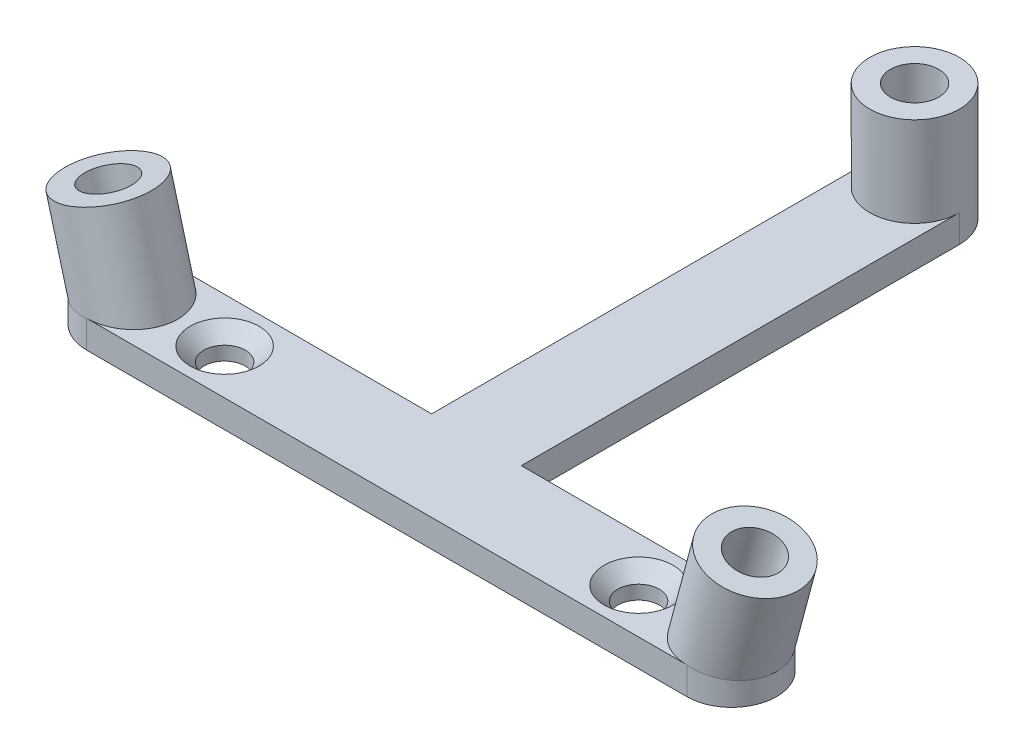
ISO-10303-21;
HEADER;
FILE_DESCRIPTION(('STEP AP214'),'2;1');
FILE_NAME('part.step','',(''),(''),'','','');
FILE_SCHEMA(('AUTOMOTIVE_DESIGN { 1 0 10303 214 1 1 1 1 }'));
ENDSEC;
DATA;
#1=APPLICATION_CONTEXT('core data for automotive mechanical design processes');
#2=APPLICATION_PROTOCOL_DEFINITION('international standard','automotive_design',2000,#1);
#3=PRODUCT_CONTEXT('',#1,'mechanical');
#4=PRODUCT('Part','Part','',(#3));
#5=PRODUCT_RELATED_PRODUCT_CATEGORY('part','',(#4));
#6=PRODUCT_DEFINITION_FORMATION('','',#4);
#7=PRODUCT_DEFINITION_CONTEXT('part definition',#1,'design');
#8=PRODUCT_DEFINITION('design','',#6,#7);
#9=PRODUCT_DEFINITION_SHAPE('','',#8);
#10=(LENGTH_UNIT() NAMED_UNIT(*) SI_UNIT(.MILLI.,.METRE.));
#11=(NAMED_UNIT(*) PLANE_ANGLE_UNIT() SI_UNIT($,.RADIAN.));
#12=(NAMED_UNIT(*) SI_UNIT($,.STERADIAN.) SOLID_ANGLE_UNIT());
#13=UNCERTAINTY_MEASURE_WITH_UNIT(LENGTH_MEASURE(1.E-05),#10,'distance_accuracy_value','');
#14=(GEOMETRIC_REPRESENTATION_CONTEXT(3) GLOBAL_UNCERTAINTY_ASSIGNED_CONTEXT((#13)) GLOBAL_UNIT_ASSIGNED_CONTEXT((#10,
#11,#12)) REPRESENTATION_CONTEXT('',''));
#15=CARTESIAN_POINT('',(0.,0.,0.));
#16=DIRECTION('',(0.,0.,1.));
#17=DIRECTION('',(1.,0.,0.));
#18=AXIS2_PLACEMENT_3D('',#15,#16,#17);
#19=CARTESIAN_POINT('',(21.75,52.4207298638169,0.));
#20=DIRECTION('',(0.,-1.,0.));
#21=DIRECTION('',(0.,0.,-1.));
#22=AXIS2_PLACEMENT_3D('',#19,#20,#21);
#23=CYLINDRICAL_SURFACE('',#22,3.25);
#24=CARTESIAN_POINT('',(21.75,1.99999999999991,0.));
#25=DIRECTION('',(-0.130526192220052,-0.99144486137381,0.));
#26=DIRECTION('',(0.99144486137381,-0.130526192220052,0.));
#27=AXIS2_PLACEMENT_3D('',#24,#25,#26);
#28=ELLIPSE('',#27,3.2780441218855,3.25);
#29=CARTESIAN_POINT('',(21.75,2.,3.25));
#30=VERTEX_POINT('',#29);
#31=CARTESIAN_POINT('',(21.75,2.,-3.25));
#32=VERTEX_POINT('',#31);
#33=EDGE_CURVE('E126',#30,#32,#28,.F.);
#34=ORIENTED_EDGE('',*,*,#33,.F.);
#35=DIRECTION('',(0.,-1.,0.));
#36=VECTOR('',#35,1.);
#37=CARTESIAN_POINT('',(21.75,52.4207298638169,3.25));
#38=LINE('',#37,#36);
#39=CARTESIAN_POINT('',(21.75,0.,3.25));
#40=VERTEX_POINT('',#39);
#41=EDGE_CURVE('E134',#30,#40,#38,.T.);
#42=ORIENTED_EDGE('',*,*,#41,.T.);
#43=CARTESIAN_POINT('',(21.75,0.,0.));
#44=DIRECTION('',(0.,1.,0.));
#45=DIRECTION('',(0.,0.,1.));
#46=AXIS2_PLACEMENT_3D('',#43,#44,#45);
#47=CIRCLE('',#46,3.25);
#48=CARTESIAN_POINT('',(21.75,0.,-3.25));
#49=VERTEX_POINT('',#48);
#50=EDGE_CURVE('E142',#40,#49,#47,.T.);
#51=ORIENTED_EDGE('',*,*,#50,.T.);
#52=DIRECTION('',(0.,-1.,0.));
#53=VECTOR('',#52,1.);
#54=CARTESIAN_POINT('',(21.75,52.4207298638169,-3.25));
#55=LINE('',#54,#53);
#56=EDGE_CURVE('E70',#32,#49,#55,.T.);
#57=ORIENTED_EDGE('',*,*,#56,.F.);
#58=EDGE_LOOP('',(#34,#42,#51,#57));
#59=FACE_BOUND('',#58,.T.);
#60=ADVANCED_FACE('F45',(#59),#23,.T.);
#61=CARTESIAN_POINT('',(-21.75,52.4207298638169,0.));
#62=DIRECTION('',(0.,-1.,0.));
#63=DIRECTION('',(0.,0.,-1.));
#64=AXIS2_PLACEMENT_3D('',#61,#62,#63);
#65=CYLINDRICAL_SURFACE('',#64,3.25);
#66=CARTESIAN_POINT('',(-21.75,1.99999999999991,0.));
#67=DIRECTION('',(0.130526192220052,-0.99144486137381,0.));
#68=DIRECTION('',(-0.99144486137381,-0.130526192220052,0.));
#69=AXIS2_PLACEMENT_3D('',#66,#67,#68);
#70=ELLIPSE('',#69,3.2780441218855,3.25);
#71=CARTESIAN_POINT('',(-21.75,2.,-3.25));
#72=VERTEX_POINT('',#71);
#73=CARTESIAN_POINT('',(-21.75,2.,3.25));
#74=VERTEX_POINT('',#73);
#75=EDGE_CURVE('E93',#72,#74,#70,.F.);
#76=ORIENTED_EDGE('',*,*,#75,.F.);
#77=DIRECTION('',(0.,-1.,0.));
#78=VECTOR('',#77,1.);
#79=CARTESIAN_POINT('',(-21.75,52.4207298638169,-3.25));
#80=LINE('',#79,#78);
#81=CARTESIAN_POINT('',(-21.75,0.,-3.25));
#82=VERTEX_POINT('',#81);
#83=EDGE_CURVE('E160',#72,#82,#80,.T.);
#84=ORIENTED_EDGE('',*,*,#83,.T.);
#85=CARTESIAN_POINT('',(-21.75,0.,0.));
#86=DIRECTION('',(0.,1.,0.));
#87=DIRECTION('',(0.,0.,1.));
#88=AXIS2_PLACEMENT_3D('',#85,#86,#87);
#89=CIRCLE('',#88,3.25);
#90=CARTESIAN_POINT('',(-21.75,0.,3.25));
#91=VERTEX_POINT('',#90);
#92=EDGE_CURVE('E154',#82,#91,#89,.T.);
#93=ORIENTED_EDGE('',*,*,#92,.T.);
#94=DIRECTION('',(0.,-1.,0.));
#95=VECTOR('',#94,1.);
#96=CARTESIAN_POINT('',(-21.75,52.4207298638169,3.25));
#97=LINE('',#96,#95);
#98=EDGE_CURVE('E87',#74,#91,#97,.T.);
#99=ORIENTED_EDGE('',*,*,#98,.F.);
#100=EDGE_LOOP('',(#76,#84,#93,#99));
#101=FACE_BOUND('',#100,.T.);
#102=ADVANCED_FACE('F265',(#101),#65,.T.);
#103=CARTESIAN_POINT('',(-21.75,52.4207298638169,-3.25));
#104=DIRECTION('',(0.,0.,1.));
#105=DIRECTION('',(1.,0.,0.));
#106=AXIS2_PLACEMENT_3D('',#103,#104,#105);
#107=PLANE('',#106);
#108=DIRECTION('',(0.,1.,0.));
#109=VECTOR('',#108,1.);
#110=CARTESIAN_POINT('',(-3.25,52.4207298638169,-3.25));
#111=LINE('',#110,#109);
#112=CARTESIAN_POINT('',(-3.25,0.,-3.25));
#113=VERTEX_POINT('',#112);
#114=CARTESIAN_POINT('',(-3.25,2.,-3.25));
#115=VERTEX_POINT('',#114);
#116=EDGE_CURVE('E162',#113,#115,#111,.T.);
#117=ORIENTED_EDGE('',*,*,#116,.F.);
#118=DIRECTION('',(-1.,0.,0.));
#119=VECTOR('',#118,1.);
#120=CARTESIAN_POINT('',(-21.75,0.,-3.25));
#121=LINE('',#120,#119);
#122=EDGE_CURVE('E159',#113,#82,#121,.T.);
#123=ORIENTED_EDGE('',*,*,#122,.T.);
#124=ORIENTED_EDGE('',*,*,#83,.F.);
#125=DIRECTION('',(-1.,0.,0.));
#126=VECTOR('',#125,1.);
#127=CARTESIAN_POINT('',(-21.75,2.,-3.25));
#128=LINE('',#127,#126);
#129=EDGE_CURVE('E151',#115,#72,#128,.T.);
#130=ORIENTED_EDGE('',*,*,#129,.F.);
#131=EDGE_LOOP('',(#117,#123,#124,#130));
#132=FACE_BOUND('',#131,.T.);
#133=ADVANCED_FACE('F261',(#132),#107,.F.);
#134=DIRECTION('',(0.,-1.,0.));
#135=VECTOR('',#134,1.);
#136=CARTESIAN_POINT('',(3.25,52.4207298638169,-3.25));
#137=LINE('',#136,#135);
#138=CARTESIAN_POINT('',(3.25,2.,-3.25));
#139=VERTEX_POINT('',#138);
#140=CARTESIAN_POINT('',(3.25,0.,-3.25));
#141=VERTEX_POINT('',#140);
#142=EDGE_CURVE('E230',#139,#141,#137,.T.);
#143=ORIENTED_EDGE('',*,*,#142,.F.);
#144=EDGE_CURVE('E146',#32,#139,#128,.T.);
#145=ORIENTED_EDGE('',*,*,#144,.F.);
#146=ORIENTED_EDGE('',*,*,#56,.T.);
#147=EDGE_CURVE('E237',#49,#141,#121,.T.);
#148=ORIENTED_EDGE('',*,*,#147,.T.);
#149=EDGE_LOOP('',(#143,#145,#146,#148));
#150=FACE_BOUND('',#149,.T.);
#151=ADVANCED_FACE('F246',(#150),#107,.F.);
#152=CARTESIAN_POINT('',(-21.75,52.4207298638169,3.25));
#153=DIRECTION('',(0.,0.,-1.));
#154=DIRECTION('',(-1.,0.,0.));
#155=AXIS2_PLACEMENT_3D('',#152,#153,#154);
#156=PLANE('',#155);
#157=DIRECTION('',(1.,0.,0.));
#158=VECTOR('',#157,1.);
#159=CARTESIAN_POINT('',(-21.75,2.,3.25));
#160=LINE('',#159,#158);
#161=EDGE_CURVE('E139',#74,#30,#160,.T.);
#162=ORIENTED_EDGE('',*,*,#161,.F.);
#163=ORIENTED_EDGE('',*,*,#98,.T.);
#164=DIRECTION('',(1.,0.,0.));
#165=VECTOR('',#164,1.);
#166=CARTESIAN_POINT('',(-21.75,0.,3.25));
#167=LINE('',#166,#165);
#168=EDGE_CURVE('E140',#91,#40,#167,.T.);
#169=ORIENTED_EDGE('',*,*,#168,.T.);
#170=ORIENTED_EDGE('',*,*,#41,.F.);
#171=EDGE_LOOP('',(#162,#163,#169,#170));
#172=FACE_BOUND('',#171,.T.);
#173=ADVANCED_FACE('F138',(#172),#156,.F.);
#174=CARTESIAN_POINT('',(-21.75,0.,0.));
#175=DIRECTION('',(0.,1.,0.));
#176=DIRECTION('',(0.,0.,1.));
#177=AXIS2_PLACEMENT_3D('',#174,#175,#176);
#178=PLANE('',#177);
#179=CARTESIAN_POINT('',(-15.,0.,0.));
#180=DIRECTION('',(0.,1.,0.));
#181=DIRECTION('',(0.,0.,1.));
#182=AXIS2_PLACEMENT_3D('',#179,#180,#181);
#183=CIRCLE('',#182,1.5);
#184=CARTESIAN_POINT('',(-15.,0.,1.5));
#185=VERTEX_POINT('',#184);
#186=EDGE_CURVE('E130',#185,#185,#183,.F.);
#187=ORIENTED_EDGE('',*,*,#186,.F.);
#188=EDGE_LOOP('',(#187));
#189=FACE_BOUND('',#188,.T.);
#190=CARTESIAN_POINT('',(15.,0.,0.));
#191=DIRECTION('',(0.,1.,0.));
#192=DIRECTION('',(0.,0.,1.));
#193=AXIS2_PLACEMENT_3D('',#190,#191,#192);
#194=CIRCLE('',#193,1.5);
#195=CARTESIAN_POINT('',(15.,0.,1.5));
#196=VERTEX_POINT('',#195);
#197=EDGE_CURVE('E189',#196,#196,#194,.F.);
#198=ORIENTED_EDGE('',*,*,#197,.F.);
#199=EDGE_LOOP('',(#198));
#200=FACE_BOUND('',#199,.T.);
#201=ORIENTED_EDGE('',*,*,#122,.F.);
#202=DIRECTION('',(0.,0.,1.));
#203=VECTOR('',#202,1.);
#204=CARTESIAN_POINT('',(-3.25,0.,0.));
#205=LINE('',#204,#203);
#206=CARTESIAN_POINT('',(-3.25,0.,-35.));
#207=VERTEX_POINT('',#206);
#208=EDGE_CURVE('E226',#207,#113,#205,.T.);
#209=ORIENTED_EDGE('',*,*,#208,.F.);
#210=CARTESIAN_POINT('',(0.,0.,-35.));
#211=DIRECTION('',(0.,1.,0.));
#212=DIRECTION('',(0.,0.,1.));
#213=AXIS2_PLACEMENT_3D('',#210,#211,#212);
#214=CIRCLE('',#213,3.24999999999999);
#215=CARTESIAN_POINT('',(3.24999999999999,0.,-35.));
#216=VERTEX_POINT('',#215);
#217=EDGE_CURVE('E220',#216,#207,#214,.T.);
#218=ORIENTED_EDGE('',*,*,#217,.F.);
#219=DIRECTION('',(0.,0.,-1.));
#220=VECTOR('',#219,1.);
#221=CARTESIAN_POINT('',(3.25,0.,0.));
#222=LINE('',#221,#220);
#223=EDGE_CURVE('E224',#141,#216,#222,.T.);
#224=ORIENTED_EDGE('',*,*,#223,.F.);
#225=ORIENTED_EDGE('',*,*,#147,.F.);
#226=ORIENTED_EDGE('',*,*,#50,.F.);
#227=ORIENTED_EDGE('',*,*,#168,.F.);
#228=ORIENTED_EDGE('',*,*,#92,.F.);
#229=EDGE_LOOP('',(#201,#209,#218,#224,#225,#226,#227,#228));
#230=FACE_BOUND('',#229,.T.);
#231=ADVANCED_FACE('F243',(#189,#200,#230),#178,.F.);
#232=CARTESIAN_POINT('',(0.,2.,0.));
#233=DIRECTION('',(0.,1.,0.));
#234=DIRECTION('',(0.,0.,1.));
#235=AXIS2_PLACEMENT_3D('',#232,#233,#234);
#236=PLANE('',#235);
#237=CARTESIAN_POINT('',(15.,2.,0.));
#238=DIRECTION('',(0.,1.,0.));
#239=DIRECTION('',(0.,0.,1.));
#240=AXIS2_PLACEMENT_3D('',#237,#238,#239);
#241=CIRCLE('',#240,2.50000000000002);
#242=CARTESIAN_POINT('',(15.,2.,2.50000000000001));
#243=VERTEX_POINT('',#242);
#244=EDGE_CURVE('E54',#243,#243,#241,.F.);
#245=ORIENTED_EDGE('',*,*,#244,.T.);
#246=EDGE_LOOP('',(#245));
#247=FACE_BOUND('',#246,.T.);
#248=CARTESIAN_POINT('',(-15.,2.,0.));
#249=DIRECTION('',(0.,1.,0.));
#250=DIRECTION('',(0.,0.,1.));
#251=AXIS2_PLACEMENT_3D('',#248,#249,#250);
#252=CIRCLE('',#251,2.50000000000002);
#253=CARTESIAN_POINT('',(-15.,2.,2.50000000000002));
#254=VERTEX_POINT('',#253);
#255=EDGE_CURVE('E169',#254,#254,#252,.F.);
#256=ORIENTED_EDGE('',*,*,#255,.T.);
#257=EDGE_LOOP('',(#256));
#258=FACE_BOUND('',#257,.T.);
#259=ORIENTED_EDGE('',*,*,#161,.T.);
#260=CARTESIAN_POINT('',(21.75,2.,0.));
#261=DIRECTION('',(0.,1.,0.));
#262=DIRECTION('',(1.,0.,0.));
#263=AXIS2_PLACEMENT_3D('',#260,#261,#262);
#264=ELLIPSE('',#263,3.36464758633277,3.25);
#265=EDGE_CURVE('E123',#30,#32,#264,.F.);
#266=ORIENTED_EDGE('',*,*,#265,.T.);
#267=ORIENTED_EDGE('',*,*,#144,.T.);
#268=DIRECTION('',(0.,0.,-1.));
#269=VECTOR('',#268,1.);
#270=CARTESIAN_POINT('',(3.25,2.,0.));
#271=LINE('',#270,#269);
#272=CARTESIAN_POINT('',(3.24999999999999,2.00000000000002,-35.));
#273=VERTEX_POINT('',#272);
#274=EDGE_CURVE('E228',#139,#273,#271,.T.);
#275=ORIENTED_EDGE('',*,*,#274,.T.);
#276=CARTESIAN_POINT('',(0.,2.00000000000001,-35.));
#277=DIRECTION('',(0.,1.,0.));
#278=DIRECTION('',(-1.,0.,0.));
#279=AXIS2_PLACEMENT_3D('',#276,#277,#278);
#280=CIRCLE('',#279,3.25);
#281=CARTESIAN_POINT('',(-3.25000000000001,2.,-35.));
#282=VERTEX_POINT('',#281);
#283=EDGE_CURVE('E211',#282,#273,#280,.T.);
#284=ORIENTED_EDGE('',*,*,#283,.F.);
#285=DIRECTION('',(0.,0.,1.));
#286=VECTOR('',#285,1.);
#287=CARTESIAN_POINT('',(-3.25,2.,0.));
#288=LINE('',#287,#286);
#289=EDGE_CURVE('E61',#282,#115,#288,.T.);
#290=ORIENTED_EDGE('',*,*,#289,.T.);
#291=ORIENTED_EDGE('',*,*,#129,.T.);
#292=CARTESIAN_POINT('',(-21.75,2.,0.));
#293=DIRECTION('',(0.,1.,0.));
#294=DIRECTION('',(-1.,0.,0.));
#295=AXIS2_PLACEMENT_3D('',#292,#293,#294);
#296=ELLIPSE('',#295,3.36464758633277,3.25);
#297=EDGE_CURVE('E135',#72,#74,#296,.F.);
#298=ORIENTED_EDGE('',*,*,#297,.T.);
#299=EDGE_LOOP('',(#259,#266,#267,#275,#284,#290,#291,#298));
#300=FACE_BOUND('',#299,.T.);
#301=ADVANCED_FACE('F144',(#247,#258,#300),#236,.T.);
#302=CARTESIAN_POINT('',(-3.25,40.7983569239729,0.));
#303=DIRECTION('',(1.,0.,0.));
#304=DIRECTION('',(0.,0.,-1.));
#305=AXIS2_PLACEMENT_3D('',#302,#303,#304);
#306=PLANE('',#305);
#307=ORIENTED_EDGE('',*,*,#208,.T.);
#308=ORIENTED_EDGE('',*,*,#116,.T.);
#309=ORIENTED_EDGE('',*,*,#289,.F.);
#310=DIRECTION('',(0.,-1.,0.));
#311=VECTOR('',#310,1.);
#312=CARTESIAN_POINT('',(-3.25,40.7983569239729,-35.));
#313=LINE('',#312,#311);
#314=EDGE_CURVE('E217',#282,#207,#313,.T.);
#315=ORIENTED_EDGE('',*,*,#314,.T.);
#316=EDGE_LOOP('',(#307,#308,#309,#315));
#317=FACE_BOUND('',#316,.T.);
#318=ADVANCED_FACE('F256',(#317),#306,.F.);
#319=CARTESIAN_POINT('',(3.25,40.7983569239729,0.));
#320=DIRECTION('',(-1.,0.,0.));
#321=DIRECTION('',(0.,0.,1.));
#322=AXIS2_PLACEMENT_3D('',#319,#320,#321);
#323=PLANE('',#322);
#324=ORIENTED_EDGE('',*,*,#274,.F.);
#325=ORIENTED_EDGE('',*,*,#142,.T.);
#326=ORIENTED_EDGE('',*,*,#223,.T.);
#327=DIRECTION('',(0.,-1.,0.));
#328=VECTOR('',#327,1.);
#329=CARTESIAN_POINT('',(3.24999999999999,40.7983569239729,-35.));
#330=LINE('',#329,#328);
#331=EDGE_CURVE('E223',#273,#216,#330,.T.);
#332=ORIENTED_EDGE('',*,*,#331,.F.);
#333=EDGE_LOOP('',(#324,#325,#326,#332));
#334=FACE_BOUND('',#333,.T.);
#335=ADVANCED_FACE('F249',(#334),#323,.F.);
#336=CARTESIAN_POINT('',(0.,40.7983569239729,-35.));
#337=DIRECTION('',(0.,-1.,0.));
#338=DIRECTION('',(0.,0.,-1.));
#339=AXIS2_PLACEMENT_3D('',#336,#337,#338);
#340=CYLINDRICAL_SURFACE('',#339,3.24999999999999);
#341=ORIENTED_EDGE('',*,*,#314,.F.);
#342=ORIENTED_EDGE('',*,*,#283,.T.);
#343=ORIENTED_EDGE('',*,*,#331,.T.);
#344=ORIENTED_EDGE('',*,*,#217,.T.);
#345=EDGE_LOOP('',(#341,#342,#343,#344));
#346=FACE_BOUND('',#345,.T.);
#347=CARTESIAN_POINT('',(0.,8.50000000000001,-35.));
#348=DIRECTION('',(0.,1.,0.));
#349=DIRECTION('',(-1.,0.,0.));
#350=AXIS2_PLACEMENT_3D('',#347,#348,#349);
#351=CIRCLE('',#350,3.25);
#352=CARTESIAN_POINT('',(-3.25000000000002,8.5,-35.));
#353=VERTEX_POINT('',#352);
#354=EDGE_CURVE('E214',#353,#353,#351,.T.);
#355=ORIENTED_EDGE('',*,*,#354,.F.);
#356=EDGE_LOOP('',(#355));
#357=FACE_BOUND('',#356,.T.);
#358=ADVANCED_FACE('F252',(#346,#357),#340,.T.);
#359=CARTESIAN_POINT('',(0.,8.50000000000001,-35.));
#360=DIRECTION('',(0.,1.,0.));
#361=DIRECTION('',(-1.,0.,0.));
#362=AXIS2_PLACEMENT_3D('',#359,#360,#361);
#363=PLANE('',#362);
#364=ORIENTED_EDGE('',*,*,#354,.T.);
#365=EDGE_LOOP('',(#364));
#366=FACE_BOUND('',#365,.T.);
#367=CARTESIAN_POINT('',(0.,8.50000000000001,-35.));
#368=DIRECTION('',(0.,1.,0.));
#369=DIRECTION('',(-1.,0.,0.));
#370=AXIS2_PLACEMENT_3D('',#367,#368,#369);
#371=CIRCLE('',#370,1.75);
#372=CARTESIAN_POINT('',(1.74999999999998,8.50000000000001,-35.));
#373=VERTEX_POINT('',#372);
#374=EDGE_CURVE('E208',#373,#373,#371,.T.);
#375=ORIENTED_EDGE('',*,*,#374,.F.);
#376=EDGE_LOOP('',(#375));
#377=FACE_BOUND('',#376,.T.);
#378=ADVANCED_FACE('F305',(#366,#377),#363,.T.);
#379=CARTESIAN_POINT('',(0.,8.50000000000001,-35.));
#380=DIRECTION('',(0.,-1.,0.));
#381=DIRECTION('',(1.,0.,0.));
#382=AXIS2_PLACEMENT_3D('',#379,#380,#381);
#383=CYLINDRICAL_SURFACE('',#382,1.75);
#384=CARTESIAN_POINT('',(0.,2.00000000000001,-35.));
#385=DIRECTION('',(0.,1.,0.));
#386=DIRECTION('',(-1.,0.,0.));
#387=AXIS2_PLACEMENT_3D('',#384,#385,#386);
#388=CIRCLE('',#387,1.75);
#389=CARTESIAN_POINT('',(1.75,2.00000000000001,-35.));
#390=VERTEX_POINT('',#389);
#391=EDGE_CURVE('E207',#390,#390,#388,.T.);
#392=CARTESIAN_POINT('',(1.74999999999998,8.50000000000001,-35.));
#393=CARTESIAN_POINT('',(1.74999999999998,8.43229166666668,-35.));
#394=CARTESIAN_POINT('',(1.74999999999998,8.36458333333334,-35.));
#395=CARTESIAN_POINT('',(1.74999999999998,8.22916666666668,-35.));
#396=CARTESIAN_POINT('',(1.74999999999998,8.16145833333334,-35.));
#397=CARTESIAN_POINT('',(1.74999999999998,8.02604166666668,-35.));
#398=CARTESIAN_POINT('',(1.74999999999998,7.95833333333334,-35.));
#399=CARTESIAN_POINT('',(1.74999999999998,7.82291666666668,-35.));
#400=CARTESIAN_POINT('',(1.74999999999998,7.75520833333335,-35.));
#401=CARTESIAN_POINT('',(1.74999999999998,7.61979166666668,-35.));
#402=CARTESIAN_POINT('',(1.74999999999998,7.55208333333335,-35.));
#403=CARTESIAN_POINT('',(1.74999999999998,7.41666666666668,-35.));
#404=CARTESIAN_POINT('',(1.74999999999998,7.34895833333335,-35.));
#405=CARTESIAN_POINT('',(1.74999999999999,7.21354166666668,-35.));
#406=CARTESIAN_POINT('',(1.74999999999999,7.14583333333335,-35.));
#407=CARTESIAN_POINT('',(1.74999999999999,7.01041666666668,-35.));
#408=CARTESIAN_POINT('',(1.74999999999999,6.94270833333335,-35.));
#409=CARTESIAN_POINT('',(1.74999999999999,6.80729166666668,-35.));
#410=CARTESIAN_POINT('',(1.74999999999999,6.73958333333335,-35.));
#411=CARTESIAN_POINT('',(1.74999999999999,6.60416666666668,-35.));
#412=CARTESIAN_POINT('',(1.74999999999999,6.53645833333335,-35.));
#413=CARTESIAN_POINT('',(1.74999999999999,6.40104166666668,-35.));
#414=CARTESIAN_POINT('',(1.74999999999999,6.33333333333335,-35.));
#415=CARTESIAN_POINT('',(1.74999999999999,6.19791666666668,-35.));
#416=CARTESIAN_POINT('',(1.74999999999999,6.13020833333335,-35.));
#417=CARTESIAN_POINT('',(1.74999999999999,5.99479166666668,-35.));
#418=CARTESIAN_POINT('',(1.74999999999999,5.92708333333335,-35.));
#419=CARTESIAN_POINT('',(1.74999999999999,5.79166666666668,-35.));
#420=CARTESIAN_POINT('',(1.74999999999999,5.72395833333335,-35.));
#421=CARTESIAN_POINT('',(1.74999999999999,5.58854166666668,-35.));
#422=CARTESIAN_POINT('',(1.74999999999999,5.52083333333335,-35.));
#423=CARTESIAN_POINT('',(1.74999999999999,5.38541666666668,-35.));
#424=CARTESIAN_POINT('',(1.74999999999999,5.31770833333335,-35.));
#425=CARTESIAN_POINT('',(1.74999999999999,5.18229166666668,-35.));
#426=CARTESIAN_POINT('',(1.74999999999999,5.11458333333335,-35.));
#427=CARTESIAN_POINT('',(1.74999999999999,4.97916666666668,-35.));
#428=CARTESIAN_POINT('',(1.74999999999999,4.91145833333335,-35.));
#429=CARTESIAN_POINT('',(1.74999999999999,4.77604166666668,-35.));
#430=CARTESIAN_POINT('',(1.74999999999999,4.70833333333335,-35.));
#431=CARTESIAN_POINT('',(1.74999999999999,4.57291666666668,-35.));
#432=CARTESIAN_POINT('',(1.74999999999999,4.50520833333335,-35.));
#433=CARTESIAN_POINT('',(1.74999999999999,4.36979166666668,-35.));
#434=CARTESIAN_POINT('',(1.74999999999999,4.30208333333335,-35.));
#435=CARTESIAN_POINT('',(1.74999999999999,4.16666666666668,-35.));
#436=CARTESIAN_POINT('',(1.74999999999999,4.09895833333335,-35.));
#437=CARTESIAN_POINT('',(1.74999999999999,3.96354166666668,-35.));
#438=CARTESIAN_POINT('',(1.74999999999999,3.89583333333335,-35.));
#439=CARTESIAN_POINT('',(1.74999999999999,3.76041666666668,-35.));
#440=CARTESIAN_POINT('',(1.74999999999999,3.69270833333335,-35.));
#441=CARTESIAN_POINT('',(1.74999999999999,3.55729166666668,-35.));
#442=CARTESIAN_POINT('',(1.74999999999999,3.48958333333335,-35.));
#443=CARTESIAN_POINT('',(1.74999999999999,3.35416666666668,-35.));
#444=CARTESIAN_POINT('',(1.74999999999999,3.28645833333335,-35.));
#445=CARTESIAN_POINT('',(1.74999999999999,3.15104166666668,-35.));
#446=CARTESIAN_POINT('',(1.74999999999999,3.08333333333335,-35.));
#447=CARTESIAN_POINT('',(1.74999999999999,2.94791666666668,-35.));
#448=CARTESIAN_POINT('',(1.74999999999999,2.88020833333335,-35.));
#449=CARTESIAN_POINT('',(1.74999999999999,2.74479166666668,-35.));
#450=CARTESIAN_POINT('',(1.74999999999999,2.67708333333335,-35.));
#451=CARTESIAN_POINT('',(1.75,2.54166666666668,-35.));
#452=CARTESIAN_POINT('',(1.75,2.47395833333335,-35.));
#453=CARTESIAN_POINT('',(1.75,2.33854166666668,-35.));
#454=CARTESIAN_POINT('',(1.75,2.27083333333335,-35.));
#455=CARTESIAN_POINT('',(1.75,2.13541666666668,-35.));
#456=CARTESIAN_POINT('',(1.75,2.06770833333335,-35.));
#457=CARTESIAN_POINT('',(1.75,2.00000000000001,-35.));
#458=B_SPLINE_CURVE_WITH_KNOTS('',3,(#392,#393,#394,#395,#396,#397,#398,#399,#400,#401,#402,
#403,#404,#405,#406,#407,#408,#409,#410,#411,#412,#413,#414,#415,#416,#417,#418,#419,#420,#421,
#422,#423,#424,#425,#426,#427,#428,#429,#430,#431,#432,#433,#434,#435,#436,#437,#438,#439,#440,
#441,#442,#443,#444,#445,#446,#447,#448,#449,#450,#451,#452,#453,#454,#455,#456,#457),
.UNSPECIFIED.,.F.,.F.,(4,2,2,2,2,2,2,2,2,2,2,2,2,2,2,2,2,2,2,2,2,2,2,2,2,2,2,2,2,2,2,2,4),(0.,
0.203125,0.40625,0.609375000000001,0.812500000000001,1.015625,1.21875,1.421875,1.625,1.828125,
2.03125,2.234375,2.4375,2.640625,2.84375,3.046875,3.25,3.453125,3.65625,3.859375,4.0625,
4.265625,4.46875,4.671875,4.875,5.078125,5.28125,5.484375,5.6875,5.890625,6.09375,6.296875,6.5),.UNSPECIFIED.);
#459=EDGE_CURVE('BSEAM296',#373,#390,#458,.T.);
#460=ORIENTED_EDGE('',*,*,#374,.T.);
#461=ORIENTED_EDGE('',*,*,#391,.F.);
#462=ORIENTED_EDGE('',*,*,#459,.T.);
#463=ORIENTED_EDGE('',*,*,#459,.F.);
#464=EDGE_LOOP('',(#460,#462,#461,#463));
#465=FACE_BOUND('',#464,.T.);
#466=ADVANCED_FACE('F296',(#465),#383,.F.);
#467=ORIENTED_EDGE('',*,*,#391,.T.);
#468=EDGE_LOOP('',(#467));
#469=FACE_BOUND('',#468,.T.);
#470=ADVANCED_FACE('F278',(#469),#236,.T.);
#471=CARTESIAN_POINT('',(-25.8114889177652,17.1576829954778,0.));
#472=DIRECTION('',(0.258819045102521,-0.965925826289068,0.));
#473=DIRECTION('',(0.965925826289068,0.258819045102521,0.));
#474=AXIS2_PLACEMENT_3D('',#471,#472,#473);
#475=CYLINDRICAL_SURFACE('',#474,3.25);
#476=CARTESIAN_POINT('',(-23.4323237931664,8.27851787087894,0.));
#477=DIRECTION('',(-0.258819045102521,0.965925826289068,0.));
#478=DIRECTION('',(-0.965925826289068,-0.258819045102521,0.));
#479=AXIS2_PLACEMENT_3D('',#476,#477,#478);
#480=CIRCLE('',#479,3.25);
#481=CARTESIAN_POINT('',(-26.5715827286059,7.43735597429575,0.));
#482=VERTEX_POINT('',#481);
#483=EDGE_CURVE('E201',#482,#482,#480,.T.);
#484=ORIENTED_EDGE('',*,*,#483,.F.);
#485=EDGE_LOOP('',(#484));
#486=FACE_BOUND('',#485,.T.);
#487=ORIENTED_EDGE('',*,*,#297,.F.);
#488=ORIENTED_EDGE('',*,*,#75,.T.);
#489=EDGE_LOOP('',(#487,#488));
#490=FACE_BOUND('',#489,.T.);
#491=ADVANCED_FACE('F295',(#486,#490),#475,.T.);
#492=CARTESIAN_POINT('',(-25.8114889177652,17.1576829954778,0.));
#493=DIRECTION('',(0.258819045102521,-0.965925826289068,0.));
#494=DIRECTION('',(0.965925826289068,0.258819045102521,0.));
#495=AXIS2_PLACEMENT_3D('',#492,#493,#494);
#496=CYLINDRICAL_SURFACE('',#495,1.75);
#497=CARTESIAN_POINT('',(-21.75,2.,0.));
#498=DIRECTION('',(0.,1.,0.));
#499=DIRECTION('',(1.,0.,0.));
#500=AXIS2_PLACEMENT_3D('',#497,#498,#499);
#501=ELLIPSE('',#500,1.81173331571765,1.75);
#502=CARTESIAN_POINT('',(-19.9382666842823,2.,0.));
#503=VERTEX_POINT('',#502);
#504=EDGE_CURVE('E145',#503,#503,#501,.F.);
#505=ORIENTED_EDGE('',*,*,#504,.T.);
#506=EDGE_LOOP('',(#505));
#507=FACE_BOUND('',#506,.T.);
#508=CARTESIAN_POINT('',(-23.4323237931664,8.27851787087894,0.));
#509=DIRECTION('',(-0.258819045102521,0.965925826289068,0.));
#510=DIRECTION('',(-0.965925826289068,-0.258819045102521,0.));
#511=AXIS2_PLACEMENT_3D('',#508,#509,#510);
#512=CIRCLE('',#511,1.75);
#513=CARTESIAN_POINT('',(-25.1226939891723,7.82558454194953,0.));
#514=VERTEX_POINT('',#513);
#515=EDGE_CURVE('E200',#514,#514,#512,.T.);
#516=ORIENTED_EDGE('',*,*,#515,.T.);
#517=EDGE_LOOP('',(#516));
#518=FACE_BOUND('',#517,.T.);
#519=ADVANCED_FACE('F302',(#507,#518),#496,.F.);
#520=CARTESIAN_POINT('',(-3.63929752701063,13.5820432746634,0.));
#521=DIRECTION('',(-0.258819045102521,0.965925826289068,0.));
#522=DIRECTION('',(-0.965925826289068,-0.258819045102521,0.));
#523=AXIS2_PLACEMENT_3D('',#520,#521,#522);
#524=PLANE('',#523);
#525=ORIENTED_EDGE('',*,*,#515,.F.);
#526=EDGE_LOOP('',(#525));
#527=FACE_BOUND('',#526,.T.);
#528=ORIENTED_EDGE('',*,*,#483,.T.);
#529=EDGE_LOOP('',(#528));
#530=FACE_BOUND('',#529,.T.);
#531=ADVANCED_FACE('F309',(#527,#530),#524,.T.);
#532=ORIENTED_EDGE('',*,*,#504,.F.);
#533=EDGE_LOOP('',(#532));
#534=FACE_BOUND('',#533,.T.);
#535=ADVANCED_FACE('F294',(#534),#236,.T.);
#536=CARTESIAN_POINT('',(25.8114889177652,17.1576829954778,0.));
#537=DIRECTION('',(-0.258819045102521,-0.965925826289068,0.));
#538=DIRECTION('',(0.965925826289068,-0.258819045102521,0.));
#539=AXIS2_PLACEMENT_3D('',#536,#537,#538);
#540=CYLINDRICAL_SURFACE('',#539,3.25);
#541=CARTESIAN_POINT('',(23.4323237931664,8.27851787087894,0.));
#542=DIRECTION('',(0.258819045102521,0.965925826289068,0.));
#543=DIRECTION('',(-0.965925826289068,0.258819045102521,0.));
#544=AXIS2_PLACEMENT_3D('',#541,#542,#543);
#545=CIRCLE('',#544,3.25);
#546=CARTESIAN_POINT('',(20.2930648577269,9.11967976746214,0.));
#547=VERTEX_POINT('',#546);
#548=EDGE_CURVE('E136',#547,#547,#545,.T.);
#549=ORIENTED_EDGE('',*,*,#548,.F.);
#550=EDGE_LOOP('',(#549));
#551=FACE_BOUND('',#550,.T.);
#552=ORIENTED_EDGE('',*,*,#265,.F.);
#553=ORIENTED_EDGE('',*,*,#33,.T.);
#554=EDGE_LOOP('',(#552,#553));
#555=FACE_BOUND('',#554,.T.);
#556=ADVANCED_FACE('F125',(#551,#555),#540,.T.);
#557=CARTESIAN_POINT('',(25.8114889177652,17.1576829954778,0.));
#558=DIRECTION('',(-0.258819045102521,-0.965925826289068,0.));
#559=DIRECTION('',(0.965925826289068,-0.258819045102521,0.));
#560=AXIS2_PLACEMENT_3D('',#557,#558,#559);
#561=CYLINDRICAL_SURFACE('',#560,1.75);
#562=CARTESIAN_POINT('',(21.75,2.,0.));
#563=DIRECTION('',(0.,1.,0.));
#564=DIRECTION('',(-1.,0.,0.));
#565=AXIS2_PLACEMENT_3D('',#562,#563,#564);
#566=ELLIPSE('',#565,1.81173331571765,1.75);
#567=CARTESIAN_POINT('',(19.9382666842823,2.,0.));
#568=VERTEX_POINT('',#567);
#569=EDGE_CURVE('E149',#568,#568,#566,.F.);
#570=ORIENTED_EDGE('',*,*,#569,.T.);
#571=EDGE_LOOP('',(#570));
#572=FACE_BOUND('',#571,.T.);
#573=CARTESIAN_POINT('',(23.4323237931664,8.27851787087894,0.));
#574=DIRECTION('',(0.258819045102521,0.965925826289068,0.));
#575=DIRECTION('',(-0.965925826289068,0.258819045102521,0.));
#576=AXIS2_PLACEMENT_3D('',#573,#574,#575);
#577=CIRCLE('',#576,1.75);
#578=CARTESIAN_POINT('',(21.7419535971605,8.73145119980835,0.));
#579=VERTEX_POINT('',#578);
#580=EDGE_CURVE('E129',#579,#579,#577,.T.);
#581=ORIENTED_EDGE('',*,*,#580,.T.);
#582=EDGE_LOOP('',(#581));
#583=FACE_BOUND('',#582,.T.);
#584=ADVANCED_FACE('F315',(#572,#583),#561,.F.);
#585=CARTESIAN_POINT('',(3.63929752701063,13.5820432746634,0.));
#586=DIRECTION('',(0.258819045102521,0.965925826289068,0.));
#587=DIRECTION('',(-0.965925826289068,0.258819045102521,0.));
#588=AXIS2_PLACEMENT_3D('',#585,#586,#587);
#589=PLANE('',#588);
#590=ORIENTED_EDGE('',*,*,#580,.F.);
#591=EDGE_LOOP('',(#590));
#592=FACE_BOUND('',#591,.T.);
#593=ORIENTED_EDGE('',*,*,#548,.T.);
#594=EDGE_LOOP('',(#593));
#595=FACE_BOUND('',#594,.T.);
#596=ADVANCED_FACE('F292',(#592,#595),#589,.T.);
#597=ORIENTED_EDGE('',*,*,#569,.F.);
#598=EDGE_LOOP('',(#597));
#599=FACE_BOUND('',#598,.T.);
#600=ADVANCED_FACE('F185',(#599),#236,.T.);
#601=CARTESIAN_POINT('',(15.,-4.24264068711929,0.));
#602=DIRECTION('',(0.,1.,0.));
#603=DIRECTION('',(0.,0.,1.));
#604=AXIS2_PLACEMENT_3D('',#601,#602,#603);
#605=CYLINDRICAL_SURFACE('',#604,1.5);
#606=CARTESIAN_POINT('',(15.,0.999999999999993,0.));
#607=DIRECTION('',(0.,1.,0.));
#608=DIRECTION('',(0.,0.,1.));
#609=AXIS2_PLACEMENT_3D('',#606,#607,#608);
#610=CIRCLE('',#609,1.5);
#611=CARTESIAN_POINT('',(15.,0.999999999999993,1.5));
#612=VERTEX_POINT('',#611);
#613=EDGE_CURVE('E166',#612,#612,#610,.T.);
#614=ORIENTED_EDGE('',*,*,#613,.T.);
#615=EDGE_LOOP('',(#614));
#616=FACE_BOUND('',#615,.T.);
#617=ORIENTED_EDGE('',*,*,#197,.T.);
#618=EDGE_LOOP('',(#617));
#619=FACE_BOUND('',#618,.T.);
#620=ADVANCED_FACE('F182',(#616,#619),#605,.F.);
#621=CARTESIAN_POINT('',(-15.,-4.24264068711929,0.));
#622=DIRECTION('',(0.,1.,0.));
#623=DIRECTION('',(0.,0.,1.));
#624=AXIS2_PLACEMENT_3D('',#621,#622,#623);
#625=CYLINDRICAL_SURFACE('',#624,1.5);
#626=CARTESIAN_POINT('',(-15.,0.999999999999993,0.));
#627=DIRECTION('',(0.,1.,0.));
#628=DIRECTION('',(0.,0.,1.));
#629=AXIS2_PLACEMENT_3D('',#626,#627,#628);
#630=CIRCLE('',#629,1.5);
#631=CARTESIAN_POINT('',(-15.,0.999999999999993,1.5));
#632=VERTEX_POINT('',#631);
#633=EDGE_CURVE('E11',#632,#632,#630,.T.);
#634=ORIENTED_EDGE('',*,*,#633,.T.);
#635=EDGE_LOOP('',(#634));
#636=FACE_BOUND('',#635,.T.);
#637=ORIENTED_EDGE('',*,*,#186,.T.);
#638=EDGE_LOOP('',(#637));
#639=FACE_BOUND('',#638,.T.);
#640=ADVANCED_FACE('F179',(#636,#639),#625,.F.);
#641=CARTESIAN_POINT('',(15.,0.999999999999993,0.));
#642=DIRECTION('',(0.,1.,0.));
#643=DIRECTION('',(0.,0.,1.));
#644=AXIS2_PLACEMENT_3D('',#641,#642,#643);
#645=CONICAL_SURFACE('',#644,1.5,0.785398163397452);
#646=ORIENTED_EDGE('',*,*,#244,.F.);
#647=EDGE_LOOP('',(#646));
#648=FACE_BOUND('',#647,.T.);
#649=ORIENTED_EDGE('',*,*,#613,.F.);
#650=EDGE_LOOP('',(#649));
#651=FACE_BOUND('',#650,.T.);
#652=ADVANCED_FACE('F176',(#648,#651),#645,.F.);
#653=CARTESIAN_POINT('',(-15.,0.999999999999993,0.));
#654=DIRECTION('',(0.,1.,0.));
#655=DIRECTION('',(0.,0.,1.));
#656=AXIS2_PLACEMENT_3D('',#653,#654,#655);
#657=CONICAL_SURFACE('',#656,1.5,0.785398163397453);
#658=ORIENTED_EDGE('',*,*,#255,.F.);
#659=EDGE_LOOP('',(#658));
#660=FACE_BOUND('',#659,.T.);
#661=ORIENTED_EDGE('',*,*,#633,.F.);
#662=EDGE_LOOP('',(#661));
#663=FACE_BOUND('',#662,.T.);
#664=ADVANCED_FACE('F48',(#660,#663),#657,.F.);
#665=CLOSED_SHELL('',(#60,#102,#133,#151,#173,#231,#301,#318,#335,#358,#378,#466,#470,#491,#519,
#531,#535,#556,#584,#596,#600,#620,#640,#652,#664));
#666=MANIFOLD_SOLID_BREP('B2',#665);
#667=ADVANCED_BREP_SHAPE_REPRESENTATION('',(#18,#666),#14);
#668=SHAPE_DEFINITION_REPRESENTATION(#9,#667);
ENDSEC;
END-ISO-10303-21;
